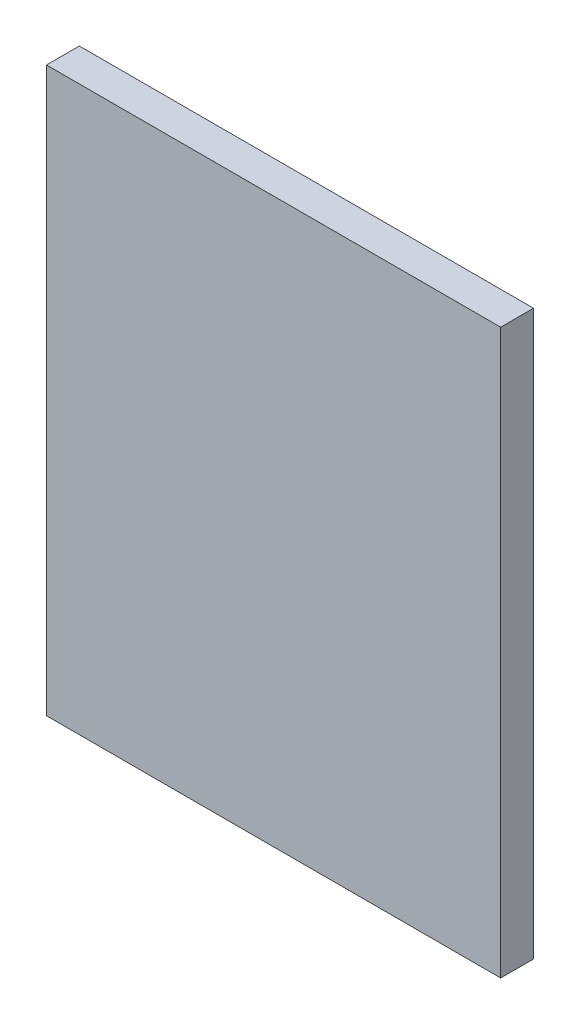
ISO-10303-21;
HEADER;
FILE_DESCRIPTION(('STEP AP214'),'2;1');
FILE_NAME('part.step','',(''),(''),'','','');
FILE_SCHEMA(('AUTOMOTIVE_DESIGN { 1 0 10303 214 1 1 1 1 }'));
ENDSEC;
DATA;
#1=APPLICATION_CONTEXT('core data for automotive mechanical design processes');
#2=APPLICATION_PROTOCOL_DEFINITION('international standard','automotive_design',2000,#1);
#3=PRODUCT_CONTEXT('',#1,'mechanical');
#4=PRODUCT('Part','Part','',(#3));
#5=PRODUCT_RELATED_PRODUCT_CATEGORY('part','',(#4));
#6=PRODUCT_DEFINITION_FORMATION('','',#4);
#7=PRODUCT_DEFINITION_CONTEXT('part definition',#1,'design');
#8=PRODUCT_DEFINITION('design','',#6,#7);
#9=PRODUCT_DEFINITION_SHAPE('','',#8);
#10=(LENGTH_UNIT() NAMED_UNIT(*) SI_UNIT(.MILLI.,.METRE.));
#11=(NAMED_UNIT(*) PLANE_ANGLE_UNIT() SI_UNIT($,.RADIAN.));
#12=(NAMED_UNIT(*) SI_UNIT($,.STERADIAN.) SOLID_ANGLE_UNIT());
#13=UNCERTAINTY_MEASURE_WITH_UNIT(LENGTH_MEASURE(1.E-05),#10,'distance_accuracy_value','');
#14=(GEOMETRIC_REPRESENTATION_CONTEXT(3) GLOBAL_UNCERTAINTY_ASSIGNED_CONTEXT((#13)) GLOBAL_UNIT_ASSIGNED_CONTEXT((#10,
#11,#12)) REPRESENTATION_CONTEXT('',''));
#15=CARTESIAN_POINT('',(0.,0.,0.));
#16=DIRECTION('',(0.,0.,1.));
#17=DIRECTION('',(1.,0.,0.));
#18=AXIS2_PLACEMENT_3D('',#15,#16,#17);
#19=CARTESIAN_POINT('',(583.,206.,12.));
#20=DIRECTION('',(-1.,0.,0.));
#21=DIRECTION('',(0.,0.,1.));
#22=AXIS2_PLACEMENT_3D('',#19,#20,#21);
#23=PLANE('',#22);
#24=DIRECTION('',(0.,1.,0.));
#25=VECTOR('',#24,1.);
#26=CARTESIAN_POINT('',(583.,206.,0.));
#27=LINE('',#26,#25);
#28=CARTESIAN_POINT('',(583.,0.,0.));
#29=VERTEX_POINT('',#28);
#30=CARTESIAN_POINT('',(583.,206.,0.));
#31=VERTEX_POINT('',#30);
#32=EDGE_CURVE('E95',#29,#31,#27,.T.);
#33=ORIENTED_EDGE('',*,*,#32,.T.);
#34=DIRECTION('',(0.,0.,-1.));
#35=VECTOR('',#34,1.);
#36=CARTESIAN_POINT('',(583.,206.,12.));
#37=LINE('',#36,#35);
#38=CARTESIAN_POINT('',(583.,206.,12.));
#39=VERTEX_POINT('',#38);
#40=EDGE_CURVE('E11',#39,#31,#37,.T.);
#41=ORIENTED_EDGE('',*,*,#40,.F.);
#42=DIRECTION('',(0.,1.,0.));
#43=VECTOR('',#42,1.);
#44=CARTESIAN_POINT('',(583.,206.,12.));
#45=LINE('',#44,#43);
#46=CARTESIAN_POINT('',(583.,0.,12.));
#47=VERTEX_POINT('',#46);
#48=EDGE_CURVE('E83',#47,#39,#45,.T.);
#49=ORIENTED_EDGE('',*,*,#48,.F.);
#50=DIRECTION('',(0.,0.,-1.));
#51=VECTOR('',#50,1.);
#52=CARTESIAN_POINT('',(583.,0.,12.));
#53=LINE('',#52,#51);
#54=EDGE_CURVE('E91',#47,#29,#53,.T.);
#55=ORIENTED_EDGE('',*,*,#54,.T.);
#56=EDGE_LOOP('',(#33,#41,#49,#55));
#57=FACE_BOUND('',#56,.T.);
#58=ADVANCED_FACE('F32',(#57),#23,.F.);
#59=CARTESIAN_POINT('',(417.,206.,12.));
#60=DIRECTION('',(0.,-1.,0.));
#61=DIRECTION('',(0.,0.,-1.));
#62=AXIS2_PLACEMENT_3D('',#59,#60,#61);
#63=PLANE('',#62);
#64=DIRECTION('',(-1.,0.,0.));
#65=VECTOR('',#64,1.);
#66=CARTESIAN_POINT('',(417.,206.,0.));
#67=LINE('',#66,#65);
#68=CARTESIAN_POINT('',(417.,206.,0.));
#69=VERTEX_POINT('',#68);
#70=EDGE_CURVE('E87',#31,#69,#67,.T.);
#71=ORIENTED_EDGE('',*,*,#70,.T.);
#72=DIRECTION('',(0.,0.,-1.));
#73=VECTOR('',#72,1.);
#74=CARTESIAN_POINT('',(417.,206.,12.));
#75=LINE('',#74,#73);
#76=CARTESIAN_POINT('',(417.,206.,12.));
#77=VERTEX_POINT('',#76);
#78=EDGE_CURVE('E40',#77,#69,#75,.T.);
#79=ORIENTED_EDGE('',*,*,#78,.F.);
#80=DIRECTION('',(-1.,0.,0.));
#81=VECTOR('',#80,1.);
#82=CARTESIAN_POINT('',(417.,206.,12.));
#83=LINE('',#82,#81);
#84=EDGE_CURVE('E78',#39,#77,#83,.T.);
#85=ORIENTED_EDGE('',*,*,#84,.F.);
#86=ORIENTED_EDGE('',*,*,#40,.T.);
#87=EDGE_LOOP('',(#71,#79,#85,#86));
#88=FACE_BOUND('',#87,.T.);
#89=ADVANCED_FACE('F86',(#88),#63,.F.);
#90=CARTESIAN_POINT('',(417.,206.,12.));
#91=DIRECTION('',(1.,0.,0.));
#92=DIRECTION('',(0.,1.,0.));
#93=AXIS2_PLACEMENT_3D('',#90,#91,#92);
#94=PLANE('',#93);
#95=DIRECTION('',(0.,-1.,0.));
#96=VECTOR('',#95,1.);
#97=CARTESIAN_POINT('',(417.,206.,0.));
#98=LINE('',#97,#96);
#99=CARTESIAN_POINT('',(417.,0.,0.));
#100=VERTEX_POINT('',#99);
#101=EDGE_CURVE('E65',#69,#100,#98,.T.);
#102=ORIENTED_EDGE('',*,*,#101,.T.);
#103=DIRECTION('',(0.,0.,-1.));
#104=VECTOR('',#103,1.);
#105=CARTESIAN_POINT('',(417.,0.,12.));
#106=LINE('',#105,#104);
#107=CARTESIAN_POINT('',(417.,0.,12.));
#108=VERTEX_POINT('',#107);
#109=EDGE_CURVE('E88',#108,#100,#106,.T.);
#110=ORIENTED_EDGE('',*,*,#109,.F.);
#111=DIRECTION('',(0.,-1.,0.));
#112=VECTOR('',#111,1.);
#113=CARTESIAN_POINT('',(417.,206.,12.));
#114=LINE('',#113,#112);
#115=EDGE_CURVE('E81',#77,#108,#114,.T.);
#116=ORIENTED_EDGE('',*,*,#115,.F.);
#117=ORIENTED_EDGE('',*,*,#78,.T.);
#118=EDGE_LOOP('',(#102,#110,#116,#117));
#119=FACE_BOUND('',#118,.T.);
#120=ADVANCED_FACE('F89',(#119),#94,.F.);
#121=CARTESIAN_POINT('',(417.,0.,12.));
#122=DIRECTION('',(0.,1.,0.));
#123=DIRECTION('',(-1.,0.,0.));
#124=AXIS2_PLACEMENT_3D('',#121,#122,#123);
#125=PLANE('',#124);
#126=DIRECTION('',(1.,0.,0.));
#127=VECTOR('',#126,1.);
#128=CARTESIAN_POINT('',(417.,0.,0.));
#129=LINE('',#128,#127);
#130=EDGE_CURVE('E71',#100,#29,#129,.T.);
#131=ORIENTED_EDGE('',*,*,#130,.T.);
#132=ORIENTED_EDGE('',*,*,#54,.F.);
#133=DIRECTION('',(1.,0.,0.));
#134=VECTOR('',#133,1.);
#135=CARTESIAN_POINT('',(417.,0.,12.));
#136=LINE('',#135,#134);
#137=EDGE_CURVE('E48',#108,#47,#136,.T.);
#138=ORIENTED_EDGE('',*,*,#137,.F.);
#139=ORIENTED_EDGE('',*,*,#109,.T.);
#140=EDGE_LOOP('',(#131,#132,#138,#139));
#141=FACE_BOUND('',#140,.T.);
#142=ADVANCED_FACE('F102',(#141),#125,.F.);
#143=CARTESIAN_POINT('',(0.,0.,12.));
#144=DIRECTION('',(0.,0.,1.));
#145=DIRECTION('',(1.,0.,0.));
#146=AXIS2_PLACEMENT_3D('',#143,#144,#145);
#147=PLANE('',#146);
#148=ORIENTED_EDGE('',*,*,#48,.T.);
#149=ORIENTED_EDGE('',*,*,#84,.T.);
#150=ORIENTED_EDGE('',*,*,#115,.T.);
#151=ORIENTED_EDGE('',*,*,#137,.T.);
#152=EDGE_LOOP('',(#148,#149,#150,#151));
#153=FACE_BOUND('',#152,.T.);
#154=ADVANCED_FACE('F79',(#153),#147,.T.);
#155=CARTESIAN_POINT('',(0.,0.,0.));
#156=DIRECTION('',(0.,0.,1.));
#157=DIRECTION('',(1.,0.,0.));
#158=AXIS2_PLACEMENT_3D('',#155,#156,#157);
#159=PLANE('',#158);
#160=ORIENTED_EDGE('',*,*,#32,.F.);
#161=ORIENTED_EDGE('',*,*,#130,.F.);
#162=ORIENTED_EDGE('',*,*,#101,.F.);
#163=ORIENTED_EDGE('',*,*,#70,.F.);
#164=EDGE_LOOP('',(#160,#161,#162,#163));
#165=FACE_BOUND('',#164,.T.);
#166=ADVANCED_FACE('F105',(#165),#159,.F.);
#167=CLOSED_SHELL('',(#58,#89,#120,#142,#154,#166));
#168=MANIFOLD_SOLID_BREP('B2',#167);
#169=ADVANCED_BREP_SHAPE_REPRESENTATION('',(#18,#168),#14);
#170=SHAPE_DEFINITION_REPRESENTATION(#9,#169);
ENDSEC;
END-ISO-10303-21;
